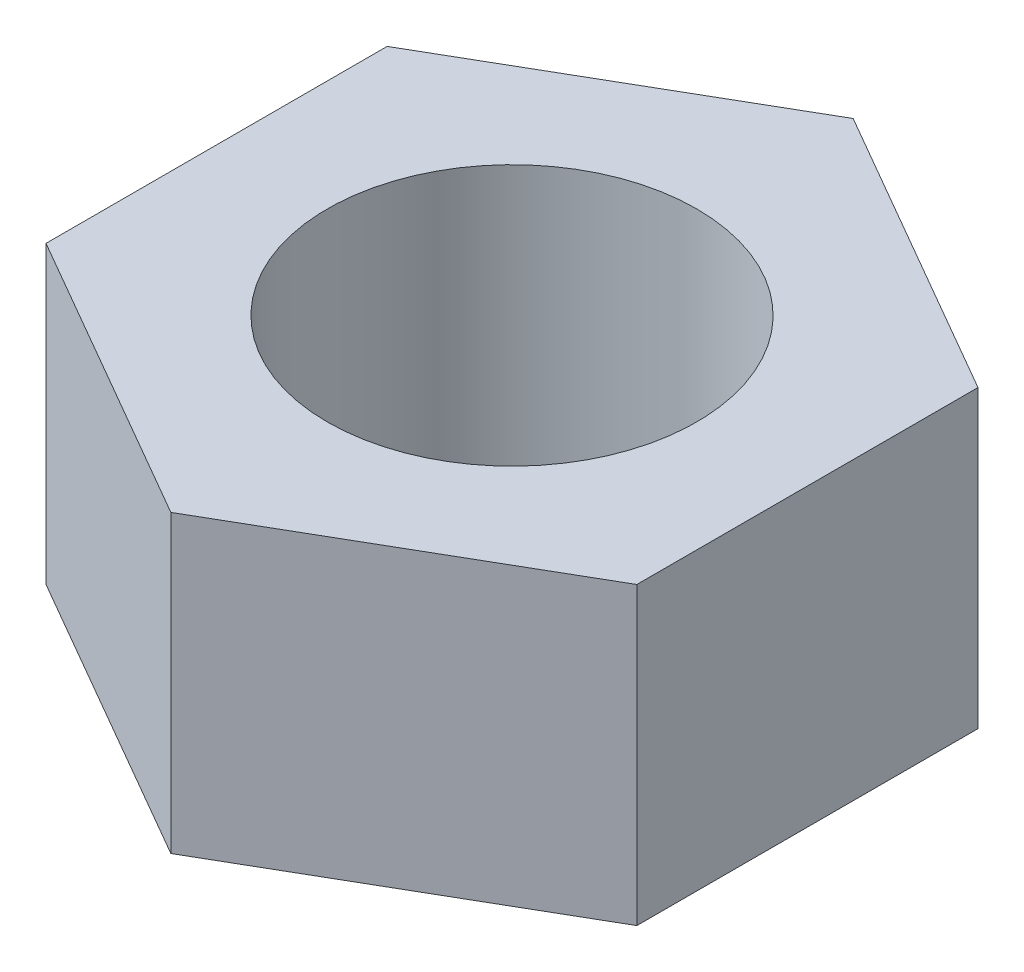
ISO-10303-21;
HEADER;
FILE_DESCRIPTION(('STEP AP214'),'2;1');
FILE_NAME('part.step','',(''),(''),'','','');
FILE_SCHEMA(('AUTOMOTIVE_DESIGN { 1 0 10303 214 1 1 1 1 }'));
ENDSEC;
DATA;
#1=APPLICATION_CONTEXT('core data for automotive mechanical design processes');
#2=APPLICATION_PROTOCOL_DEFINITION('international standard','automotive_design',2000,#1);
#3=PRODUCT_CONTEXT('',#1,'mechanical');
#4=PRODUCT('Part','Part','',(#3));
#5=PRODUCT_RELATED_PRODUCT_CATEGORY('part','',(#4));
#6=PRODUCT_DEFINITION_FORMATION('','',#4);
#7=PRODUCT_DEFINITION_CONTEXT('part definition',#1,'design');
#8=PRODUCT_DEFINITION('design','',#6,#7);
#9=PRODUCT_DEFINITION_SHAPE('','',#8);
#10=(LENGTH_UNIT() NAMED_UNIT(*) SI_UNIT(.MILLI.,.METRE.));
#11=(NAMED_UNIT(*) PLANE_ANGLE_UNIT() SI_UNIT($,.RADIAN.));
#12=(NAMED_UNIT(*) SI_UNIT($,.STERADIAN.) SOLID_ANGLE_UNIT());
#13=UNCERTAINTY_MEASURE_WITH_UNIT(LENGTH_MEASURE(1.E-05),#10,'distance_accuracy_value','');
#14=(GEOMETRIC_REPRESENTATION_CONTEXT(3) GLOBAL_UNCERTAINTY_ASSIGNED_CONTEXT((#13)) GLOBAL_UNIT_ASSIGNED_CONTEXT((#10,
#11,#12)) REPRESENTATION_CONTEXT('',''));
#15=CARTESIAN_POINT('',(0.,0.,0.));
#16=DIRECTION('',(0.,0.,1.));
#17=DIRECTION('',(1.,0.,0.));
#18=AXIS2_PLACEMENT_3D('',#15,#16,#17);
#19=CARTESIAN_POINT('',(0.,4.,0.));
#20=DIRECTION('',(0.,1.,0.));
#21=DIRECTION('',(0.,0.,1.));
#22=AXIS2_PLACEMENT_3D('',#19,#20,#21);
#23=PLANE('',#22);
#24=DIRECTION('',(-0.866025403784439,0.,-0.5));
#25=VECTOR('',#24,1.);
#26=CARTESIAN_POINT('',(4.,4.,-2.3094010767585));
#27=LINE('',#26,#25);
#28=CARTESIAN_POINT('',(4.,4.,-2.3094010767585));
#29=VERTEX_POINT('',#28);
#30=CARTESIAN_POINT('',(0.,4.,-4.61880215351701));
#31=VERTEX_POINT('',#30);
#32=EDGE_CURVE('E128',#29,#31,#27,.T.);
#33=ORIENTED_EDGE('',*,*,#32,.T.);
#34=DIRECTION('',(-0.866025403784439,0.,0.5));
#35=VECTOR('',#34,1.);
#36=CARTESIAN_POINT('',(0.,4.,-4.61880215351701));
#37=LINE('',#36,#35);
#38=CARTESIAN_POINT('',(-4.,4.,-2.3094010767585));
#39=VERTEX_POINT('',#38);
#40=EDGE_CURVE('E86',#31,#39,#37,.T.);
#41=ORIENTED_EDGE('',*,*,#40,.T.);
#42=DIRECTION('',(0.,0.,1.));
#43=VECTOR('',#42,1.);
#44=CARTESIAN_POINT('',(-4.,4.,-2.3094010767585));
#45=LINE('',#44,#43);
#46=CARTESIAN_POINT('',(-4.,4.,2.3094010767585));
#47=VERTEX_POINT('',#46);
#48=EDGE_CURVE('E99',#39,#47,#45,.T.);
#49=ORIENTED_EDGE('',*,*,#48,.T.);
#50=DIRECTION('',(0.866025403784439,0.,0.5));
#51=VECTOR('',#50,1.);
#52=CARTESIAN_POINT('',(-4.,4.,2.3094010767585));
#53=LINE('',#52,#51);
#54=CARTESIAN_POINT('',(0.,4.,4.61880215351701));
#55=VERTEX_POINT('',#54);
#56=EDGE_CURVE('E93',#47,#55,#53,.T.);
#57=ORIENTED_EDGE('',*,*,#56,.T.);
#58=DIRECTION('',(0.866025403784439,0.,-0.5));
#59=VECTOR('',#58,1.);
#60=CARTESIAN_POINT('',(0.,4.,4.61880215351701));
#61=LINE('',#60,#59);
#62=CARTESIAN_POINT('',(4.,4.,2.30940107675851));
#63=VERTEX_POINT('',#62);
#64=EDGE_CURVE('E97',#55,#63,#61,.T.);
#65=ORIENTED_EDGE('',*,*,#64,.T.);
#66=DIRECTION('',(0.,0.,-1.));
#67=VECTOR('',#66,1.);
#68=CARTESIAN_POINT('',(4.,4.,2.30940107675851));
#69=LINE('',#68,#67);
#70=EDGE_CURVE('E49',#63,#29,#69,.T.);
#71=ORIENTED_EDGE('',*,*,#70,.T.);
#72=EDGE_LOOP('',(#33,#41,#49,#57,#65,#71));
#73=FACE_BOUND('',#72,.T.);
#74=CARTESIAN_POINT('',(0.,4.,0.));
#75=DIRECTION('',(0.,1.,0.));
#76=DIRECTION('',(0.,0.,1.));
#77=AXIS2_PLACEMENT_3D('',#74,#75,#76);
#78=CIRCLE('',#77,2.5);
#79=CARTESIAN_POINT('',(0.,4.,2.5));
#80=VERTEX_POINT('',#79);
#81=EDGE_CURVE('E121',#80,#80,#78,.T.);
#82=ORIENTED_EDGE('',*,*,#81,.F.);
#83=EDGE_LOOP('',(#82));
#84=FACE_BOUND('',#83,.T.);
#85=ADVANCED_FACE('F32',(#73,#84),#23,.T.);
#86=CARTESIAN_POINT('',(0.,0.,0.));
#87=DIRECTION('',(0.,1.,0.));
#88=DIRECTION('',(0.,0.,1.));
#89=AXIS2_PLACEMENT_3D('',#86,#87,#88);
#90=PLANE('',#89);
#91=DIRECTION('',(-0.866025403784439,0.,-0.5));
#92=VECTOR('',#91,1.);
#93=CARTESIAN_POINT('',(4.,0.,-2.3094010767585));
#94=LINE('',#93,#92);
#95=CARTESIAN_POINT('',(4.,0.,-2.3094010767585));
#96=VERTEX_POINT('',#95);
#97=CARTESIAN_POINT('',(0.,0.,-4.61880215351701));
#98=VERTEX_POINT('',#97);
#99=EDGE_CURVE('E117',#96,#98,#94,.T.);
#100=ORIENTED_EDGE('',*,*,#99,.F.);
#101=DIRECTION('',(0.,0.,-1.));
#102=VECTOR('',#101,1.);
#103=CARTESIAN_POINT('',(4.,0.,2.30940107675851));
#104=LINE('',#103,#102);
#105=CARTESIAN_POINT('',(4.,0.,2.30940107675851));
#106=VERTEX_POINT('',#105);
#107=EDGE_CURVE('E78',#106,#96,#104,.T.);
#108=ORIENTED_EDGE('',*,*,#107,.F.);
#109=DIRECTION('',(0.866025403784439,0.,-0.5));
#110=VECTOR('',#109,1.);
#111=CARTESIAN_POINT('',(0.,0.,4.61880215351701));
#112=LINE('',#111,#110);
#113=CARTESIAN_POINT('',(0.,0.,4.61880215351701));
#114=VERTEX_POINT('',#113);
#115=EDGE_CURVE('E72',#114,#106,#112,.T.);
#116=ORIENTED_EDGE('',*,*,#115,.F.);
#117=DIRECTION('',(0.866025403784439,0.,0.5));
#118=VECTOR('',#117,1.);
#119=CARTESIAN_POINT('',(-4.,0.,2.3094010767585));
#120=LINE('',#119,#118);
#121=CARTESIAN_POINT('',(-4.,0.,2.3094010767585));
#122=VERTEX_POINT('',#121);
#123=EDGE_CURVE('E107',#122,#114,#120,.T.);
#124=ORIENTED_EDGE('',*,*,#123,.F.);
#125=DIRECTION('',(0.,0.,1.));
#126=VECTOR('',#125,1.);
#127=CARTESIAN_POINT('',(-4.,0.,-2.3094010767585));
#128=LINE('',#127,#126);
#129=CARTESIAN_POINT('',(-4.,0.,-2.3094010767585));
#130=VERTEX_POINT('',#129);
#131=EDGE_CURVE('E123',#130,#122,#128,.T.);
#132=ORIENTED_EDGE('',*,*,#131,.F.);
#133=DIRECTION('',(-0.866025403784439,0.,0.5));
#134=VECTOR('',#133,1.);
#135=CARTESIAN_POINT('',(0.,0.,-4.61880215351701));
#136=LINE('',#135,#134);
#137=EDGE_CURVE('E120',#98,#130,#136,.T.);
#138=ORIENTED_EDGE('',*,*,#137,.F.);
#139=EDGE_LOOP('',(#100,#108,#116,#124,#132,#138));
#140=FACE_BOUND('',#139,.T.);
#141=CARTESIAN_POINT('',(0.,0.,0.));
#142=DIRECTION('',(0.,1.,0.));
#143=DIRECTION('',(0.,0.,1.));
#144=AXIS2_PLACEMENT_3D('',#141,#142,#143);
#145=CIRCLE('',#144,2.5);
#146=CARTESIAN_POINT('',(0.,0.,2.5));
#147=VERTEX_POINT('',#146);
#148=EDGE_CURVE('E221',#147,#147,#145,.T.);
#149=ORIENTED_EDGE('',*,*,#148,.T.);
#150=EDGE_LOOP('',(#149));
#151=FACE_BOUND('',#150,.T.);
#152=ADVANCED_FACE('F137',(#140,#151),#90,.F.);
#153=CARTESIAN_POINT('',(4.,4.,-2.3094010767585));
#154=DIRECTION('',(-0.5,0.,0.866025403784439));
#155=DIRECTION('',(0.866025403784439,0.,0.5));
#156=AXIS2_PLACEMENT_3D('',#153,#154,#155);
#157=PLANE('',#156);
#158=ORIENTED_EDGE('',*,*,#99,.T.);
#159=DIRECTION('',(0.,-1.,0.));
#160=VECTOR('',#159,1.);
#161=CARTESIAN_POINT('',(0.,4.,-4.61880215351701));
#162=LINE('',#161,#160);
#163=EDGE_CURVE('E11',#31,#98,#162,.T.);
#164=ORIENTED_EDGE('',*,*,#163,.F.);
#165=ORIENTED_EDGE('',*,*,#32,.F.);
#166=DIRECTION('',(0.,-1.,0.));
#167=VECTOR('',#166,1.);
#168=CARTESIAN_POINT('',(4.,4.,-2.3094010767585));
#169=LINE('',#168,#167);
#170=EDGE_CURVE('E113',#29,#96,#169,.T.);
#171=ORIENTED_EDGE('',*,*,#170,.T.);
#172=EDGE_LOOP('',(#158,#164,#165,#171));
#173=FACE_BOUND('',#172,.T.);
#174=ADVANCED_FACE('F34',(#173),#157,.F.);
#175=CARTESIAN_POINT('',(0.,4.,-4.61880215351701));
#176=DIRECTION('',(0.5,0.,0.866025403784439));
#177=DIRECTION('',(0.866025403784439,0.,-0.5));
#178=AXIS2_PLACEMENT_3D('',#175,#176,#177);
#179=PLANE('',#178);
#180=ORIENTED_EDGE('',*,*,#137,.T.);
#181=DIRECTION('',(0.,-1.,0.));
#182=VECTOR('',#181,1.);
#183=CARTESIAN_POINT('',(-4.,4.,-2.3094010767585));
#184=LINE('',#183,#182);
#185=EDGE_CURVE('E41',#39,#130,#184,.T.);
#186=ORIENTED_EDGE('',*,*,#185,.F.);
#187=ORIENTED_EDGE('',*,*,#40,.F.);
#188=ORIENTED_EDGE('',*,*,#163,.T.);
#189=EDGE_LOOP('',(#180,#186,#187,#188));
#190=FACE_BOUND('',#189,.T.);
#191=ADVANCED_FACE('F162',(#190),#179,.F.);
#192=CARTESIAN_POINT('',(-4.,4.,-2.3094010767585));
#193=DIRECTION('',(1.,0.,0.));
#194=DIRECTION('',(0.,0.,-1.));
#195=AXIS2_PLACEMENT_3D('',#192,#193,#194);
#196=PLANE('',#195);
#197=ORIENTED_EDGE('',*,*,#131,.T.);
#198=DIRECTION('',(0.,-1.,0.));
#199=VECTOR('',#198,1.);
#200=CARTESIAN_POINT('',(-4.,4.,2.3094010767585));
#201=LINE('',#200,#199);
#202=EDGE_CURVE('E108',#47,#122,#201,.T.);
#203=ORIENTED_EDGE('',*,*,#202,.F.);
#204=ORIENTED_EDGE('',*,*,#48,.F.);
#205=ORIENTED_EDGE('',*,*,#185,.T.);
#206=EDGE_LOOP('',(#197,#203,#204,#205));
#207=FACE_BOUND('',#206,.T.);
#208=ADVANCED_FACE('F134',(#207),#196,.F.);
#209=CARTESIAN_POINT('',(-4.,4.,2.3094010767585));
#210=DIRECTION('',(0.5,0.,-0.866025403784439));
#211=DIRECTION('',(-0.866025403784439,0.,-0.5));
#212=AXIS2_PLACEMENT_3D('',#209,#210,#211);
#213=PLANE('',#212);
#214=ORIENTED_EDGE('',*,*,#123,.T.);
#215=DIRECTION('',(0.,-1.,0.));
#216=VECTOR('',#215,1.);
#217=CARTESIAN_POINT('',(0.,4.,4.61880215351701));
#218=LINE('',#217,#216);
#219=EDGE_CURVE('E104',#55,#114,#218,.T.);
#220=ORIENTED_EDGE('',*,*,#219,.F.);
#221=ORIENTED_EDGE('',*,*,#56,.F.);
#222=ORIENTED_EDGE('',*,*,#202,.T.);
#223=EDGE_LOOP('',(#214,#220,#221,#222));
#224=FACE_BOUND('',#223,.T.);
#225=ADVANCED_FACE('F105',(#224),#213,.F.);
#226=CARTESIAN_POINT('',(0.,4.,4.61880215351701));
#227=DIRECTION('',(-0.5,0.,-0.866025403784439));
#228=DIRECTION('',(-0.866025403784439,0.,0.5));
#229=AXIS2_PLACEMENT_3D('',#226,#227,#228);
#230=PLANE('',#229);
#231=ORIENTED_EDGE('',*,*,#115,.T.);
#232=DIRECTION('',(0.,-1.,0.));
#233=VECTOR('',#232,1.);
#234=CARTESIAN_POINT('',(4.,4.,2.30940107675851));
#235=LINE('',#234,#233);
#236=EDGE_CURVE('E109',#63,#106,#235,.T.);
#237=ORIENTED_EDGE('',*,*,#236,.F.);
#238=ORIENTED_EDGE('',*,*,#64,.F.);
#239=ORIENTED_EDGE('',*,*,#219,.T.);
#240=EDGE_LOOP('',(#231,#237,#238,#239));
#241=FACE_BOUND('',#240,.T.);
#242=ADVANCED_FACE('F111',(#241),#230,.F.);
#243=CARTESIAN_POINT('',(4.,4.,2.30940107675851));
#244=DIRECTION('',(-1.,0.,0.));
#245=DIRECTION('',(0.,0.,1.));
#246=AXIS2_PLACEMENT_3D('',#243,#244,#245);
#247=PLANE('',#246);
#248=ORIENTED_EDGE('',*,*,#107,.T.);
#249=ORIENTED_EDGE('',*,*,#170,.F.);
#250=ORIENTED_EDGE('',*,*,#70,.F.);
#251=ORIENTED_EDGE('',*,*,#236,.T.);
#252=EDGE_LOOP('',(#248,#249,#250,#251));
#253=FACE_BOUND('',#252,.T.);
#254=ADVANCED_FACE('F142',(#253),#247,.F.);
#255=CARTESIAN_POINT('',(0.,4.,0.));
#256=DIRECTION('',(0.,-1.,0.));
#257=DIRECTION('',(0.,0.,-1.));
#258=AXIS2_PLACEMENT_3D('',#255,#256,#257);
#259=CYLINDRICAL_SURFACE('',#258,2.5);
#260=ORIENTED_EDGE('',*,*,#81,.T.);
#261=EDGE_LOOP('',(#260));
#262=FACE_BOUND('',#261,.T.);
#263=ORIENTED_EDGE('',*,*,#148,.F.);
#264=EDGE_LOOP('',(#263));
#265=FACE_BOUND('',#264,.T.);
#266=ADVANCED_FACE('F144',(#262,#265),#259,.F.);
#267=CLOSED_SHELL('',(#85,#152,#174,#191,#208,#225,#242,#254,#266));
#268=MANIFOLD_SOLID_BREP('B2',#267);
#269=ADVANCED_BREP_SHAPE_REPRESENTATION('',(#18,#268),#14);
#270=SHAPE_DEFINITION_REPRESENTATION(#9,#269);
ENDSEC;
END-ISO-10303-21;
